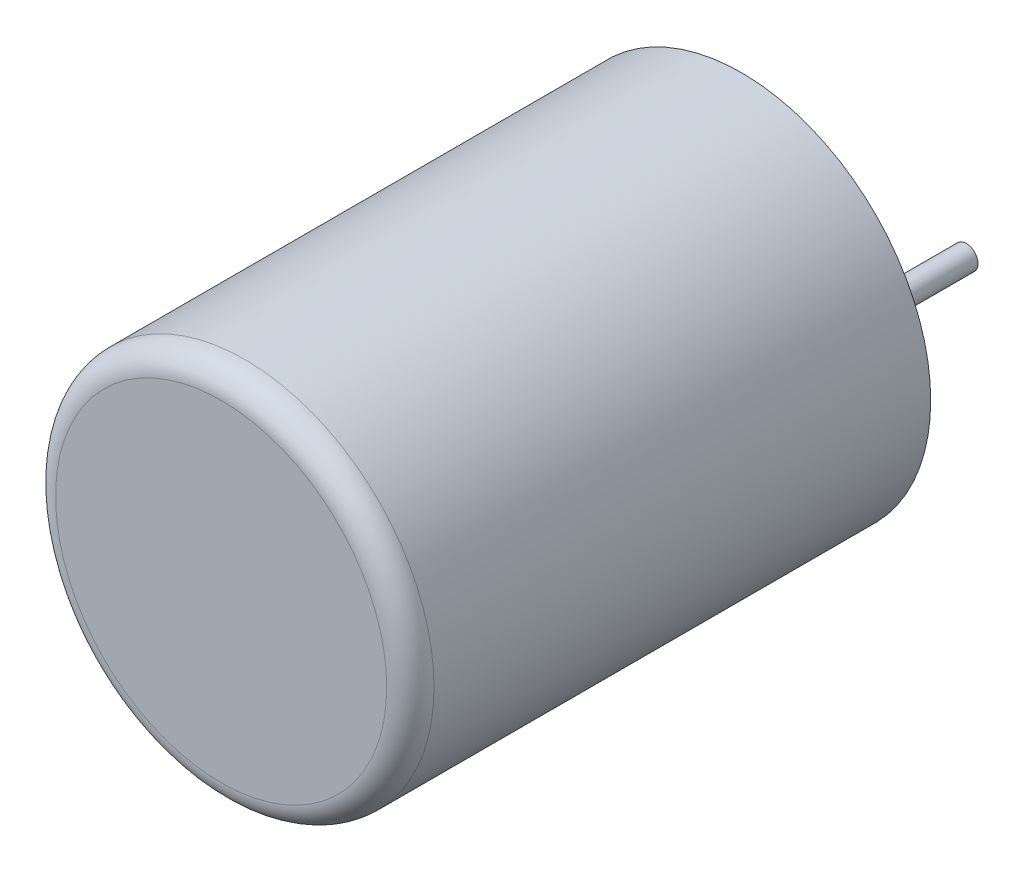
ISO-10303-21;
HEADER;
FILE_DESCRIPTION(('STEP AP214'),'2;1');
FILE_NAME('part.step','',(''),(''),'','','');
FILE_SCHEMA(('AUTOMOTIVE_DESIGN { 1 0 10303 214 1 1 1 1 }'));
ENDSEC;
DATA;
#1=APPLICATION_CONTEXT('core data for automotive mechanical design processes');
#2=APPLICATION_PROTOCOL_DEFINITION('international standard','automotive_design',2000,#1);
#3=PRODUCT_CONTEXT('',#1,'mechanical');
#4=PRODUCT('Part','Part','',(#3));
#5=PRODUCT_RELATED_PRODUCT_CATEGORY('part','',(#4));
#6=PRODUCT_DEFINITION_FORMATION('','',#4);
#7=PRODUCT_DEFINITION_CONTEXT('part definition',#1,'design');
#8=PRODUCT_DEFINITION('design','',#6,#7);
#9=PRODUCT_DEFINITION_SHAPE('','',#8);
#10=(LENGTH_UNIT() NAMED_UNIT(*) SI_UNIT(.MILLI.,.METRE.));
#11=(NAMED_UNIT(*) PLANE_ANGLE_UNIT() SI_UNIT($,.RADIAN.));
#12=(NAMED_UNIT(*) SI_UNIT($,.STERADIAN.) SOLID_ANGLE_UNIT());
#13=UNCERTAINTY_MEASURE_WITH_UNIT(LENGTH_MEASURE(1.E-05),#10,'distance_accuracy_value','');
#14=(GEOMETRIC_REPRESENTATION_CONTEXT(3) GLOBAL_UNCERTAINTY_ASSIGNED_CONTEXT((#13)) GLOBAL_UNIT_ASSIGNED_CONTEXT((#10,
#11,#12)) REPRESENTATION_CONTEXT('',''));
#15=CARTESIAN_POINT('',(0.,0.,0.));
#16=DIRECTION('',(0.,0.,1.));
#17=DIRECTION('',(1.,0.,0.));
#18=AXIS2_PLACEMENT_3D('',#15,#16,#17);
#19=CARTESIAN_POINT('',(0.,0.,0.));
#20=DIRECTION('',(0.,0.,1.));
#21=DIRECTION('',(1.,0.,0.));
#22=AXIS2_PLACEMENT_3D('',#19,#20,#21);
#23=PLANE('',#22);
#24=CARTESIAN_POINT('',(1.75,0.,0.));
#25=DIRECTION('',(0.,0.,1.));
#26=DIRECTION('',(1.,0.,0.));
#27=AXIS2_PLACEMENT_3D('',#24,#25,#26);
#28=CIRCLE('',#27,0.25);
#29=CARTESIAN_POINT('',(2.,0.,0.));
#30=VERTEX_POINT('',#29);
#31=EDGE_CURVE('E44',#30,#30,#28,.F.);
#32=ORIENTED_EDGE('',*,*,#31,.F.);
#33=EDGE_LOOP('',(#32));
#34=FACE_BOUND('',#33,.T.);
#35=CARTESIAN_POINT('',(0.,0.,0.));
#36=DIRECTION('',(0.,0.,1.));
#37=DIRECTION('',(1.,0.,0.));
#38=AXIS2_PLACEMENT_3D('',#35,#36,#37);
#39=CIRCLE('',#38,4.);
#40=CARTESIAN_POINT('',(4.,0.,0.));
#41=VERTEX_POINT('',#40);
#42=EDGE_CURVE('E49',#41,#41,#39,.T.);
#43=ORIENTED_EDGE('',*,*,#42,.F.);
#44=EDGE_LOOP('',(#43));
#45=FACE_BOUND('',#44,.T.);
#46=CARTESIAN_POINT('',(-1.75,0.,0.));
#47=DIRECTION('',(0.,0.,1.));
#48=DIRECTION('',(1.,0.,0.));
#49=AXIS2_PLACEMENT_3D('',#46,#47,#48);
#50=CIRCLE('',#49,0.250000000000001);
#51=CARTESIAN_POINT('',(-1.5,0.,0.));
#52=VERTEX_POINT('',#51);
#53=EDGE_CURVE('E40',#52,#52,#50,.F.);
#54=ORIENTED_EDGE('',*,*,#53,.F.);
#55=EDGE_LOOP('',(#54));
#56=FACE_BOUND('',#55,.T.);
#57=ADVANCED_FACE('F29',(#34,#45,#56),#23,.F.);
#58=CARTESIAN_POINT('',(0.,0.,11.));
#59=DIRECTION('',(0.,0.,-1.));
#60=DIRECTION('',(-1.,0.,0.));
#61=AXIS2_PLACEMENT_3D('',#58,#59,#60);
#62=CYLINDRICAL_SURFACE('',#61,4.);
#63=CARTESIAN_POINT('',(0.,0.,10.5));
#64=DIRECTION('',(0.,0.,1.));
#65=DIRECTION('',(1.,0.,0.));
#66=AXIS2_PLACEMENT_3D('',#63,#64,#65);
#67=CIRCLE('',#66,4.);
#68=CARTESIAN_POINT('',(4.,0.,10.5));
#69=VERTEX_POINT('',#68);
#70=EDGE_CURVE('E10',#69,#69,#67,.F.);
#71=ORIENTED_EDGE('',*,*,#70,.T.);
#72=EDGE_LOOP('',(#71));
#73=FACE_BOUND('',#72,.T.);
#74=ORIENTED_EDGE('',*,*,#42,.T.);
#75=EDGE_LOOP('',(#74));
#76=FACE_BOUND('',#75,.T.);
#77=ADVANCED_FACE('F69',(#73,#76),#62,.T.);
#78=CARTESIAN_POINT('',(0.,0.,11.));
#79=DIRECTION('',(0.,0.,1.));
#80=DIRECTION('',(1.,0.,0.));
#81=AXIS2_PLACEMENT_3D('',#78,#79,#80);
#82=PLANE('',#81);
#83=CARTESIAN_POINT('',(0.,0.,11.));
#84=DIRECTION('',(0.,0.,1.));
#85=DIRECTION('',(1.,0.,0.));
#86=AXIS2_PLACEMENT_3D('',#83,#84,#85);
#87=CIRCLE('',#86,3.5);
#88=CARTESIAN_POINT('',(3.5,0.,11.));
#89=VERTEX_POINT('',#88);
#90=EDGE_CURVE('E36',#89,#89,#87,.T.);
#91=ORIENTED_EDGE('',*,*,#90,.T.);
#92=EDGE_LOOP('',(#91));
#93=FACE_BOUND('',#92,.T.);
#94=ADVANCED_FACE('F75',(#93),#82,.T.);
#95=CARTESIAN_POINT('',(1.75,0.,-3.));
#96=DIRECTION('',(0.,0.,1.));
#97=DIRECTION('',(1.,0.,0.));
#98=AXIS2_PLACEMENT_3D('',#95,#96,#97);
#99=CYLINDRICAL_SURFACE('',#98,0.25);
#100=CARTESIAN_POINT('',(1.75,0.,-3.));
#101=DIRECTION('',(0.,0.,-1.));
#102=DIRECTION('',(-1.,0.,0.));
#103=AXIS2_PLACEMENT_3D('',#100,#101,#102);
#104=CIRCLE('',#103,0.25);
#105=CARTESIAN_POINT('',(1.5,0.,-3.));
#106=VERTEX_POINT('',#105);
#107=EDGE_CURVE('E52',#106,#106,#104,.T.);
#108=ORIENTED_EDGE('',*,*,#107,.F.);
#109=EDGE_LOOP('',(#108));
#110=FACE_BOUND('',#109,.T.);
#111=ORIENTED_EDGE('',*,*,#31,.T.);
#112=EDGE_LOOP('',(#111));
#113=FACE_BOUND('',#112,.T.);
#114=ADVANCED_FACE('F81',(#110,#113),#99,.T.);
#115=CARTESIAN_POINT('',(1.75,0.,-3.));
#116=DIRECTION('',(0.,0.,-1.));
#117=DIRECTION('',(-1.,0.,0.));
#118=AXIS2_PLACEMENT_3D('',#115,#116,#117);
#119=PLANE('',#118);
#120=ORIENTED_EDGE('',*,*,#107,.T.);
#121=EDGE_LOOP('',(#120));
#122=FACE_BOUND('',#121,.T.);
#123=ADVANCED_FACE('F64',(#122),#119,.T.);
#124=CARTESIAN_POINT('',(-1.75,0.,-3.));
#125=DIRECTION('',(0.,0.,1.));
#126=DIRECTION('',(1.,0.,0.));
#127=AXIS2_PLACEMENT_3D('',#124,#125,#126);
#128=CYLINDRICAL_SURFACE('',#127,0.250000000000001);
#129=CARTESIAN_POINT('',(-1.75,0.,-3.));
#130=DIRECTION('',(0.,0.,-1.));
#131=DIRECTION('',(-1.,0.,0.));
#132=AXIS2_PLACEMENT_3D('',#129,#130,#131);
#133=CIRCLE('',#132,0.250000000000001);
#134=CARTESIAN_POINT('',(-2.,0.,-3.));
#135=VERTEX_POINT('',#134);
#136=EDGE_CURVE('E55',#135,#135,#133,.T.);
#137=ORIENTED_EDGE('',*,*,#136,.F.);
#138=EDGE_LOOP('',(#137));
#139=FACE_BOUND('',#138,.T.);
#140=ORIENTED_EDGE('',*,*,#53,.T.);
#141=EDGE_LOOP('',(#140));
#142=FACE_BOUND('',#141,.T.);
#143=ADVANCED_FACE('F61',(#139,#142),#128,.T.);
#144=CARTESIAN_POINT('',(-1.75,0.,-3.));
#145=DIRECTION('',(0.,0.,-1.));
#146=DIRECTION('',(-1.,0.,0.));
#147=AXIS2_PLACEMENT_3D('',#144,#145,#146);
#148=PLANE('',#147);
#149=ORIENTED_EDGE('',*,*,#136,.T.);
#150=EDGE_LOOP('',(#149));
#151=FACE_BOUND('',#150,.T.);
#152=ADVANCED_FACE('F59',(#151),#148,.T.);
#153=CARTESIAN_POINT('',(0.,0.,10.5));
#154=DIRECTION('',(0.,0.,1.));
#155=DIRECTION('',(1.,0.,0.));
#156=AXIS2_PLACEMENT_3D('',#153,#154,#155);
#157=TOROIDAL_SURFACE('',#156,3.5,0.5);
#158=ORIENTED_EDGE('',*,*,#70,.F.);
#159=EDGE_LOOP('',(#158));
#160=FACE_BOUND('',#159,.T.);
#161=ORIENTED_EDGE('',*,*,#90,.F.);
#162=EDGE_LOOP('',(#161));
#163=FACE_BOUND('',#162,.T.);
#164=ADVANCED_FACE('F31',(#160,#163),#157,.T.);
#165=CLOSED_SHELL('',(#57,#77,#94,#114,#123,#143,#152,#164));
#166=MANIFOLD_SOLID_BREP('B2',#165);
#167=ADVANCED_BREP_SHAPE_REPRESENTATION('',(#18,#166),#14);
#168=SHAPE_DEFINITION_REPRESENTATION(#9,#167);
ENDSEC;
END-ISO-10303-21;
